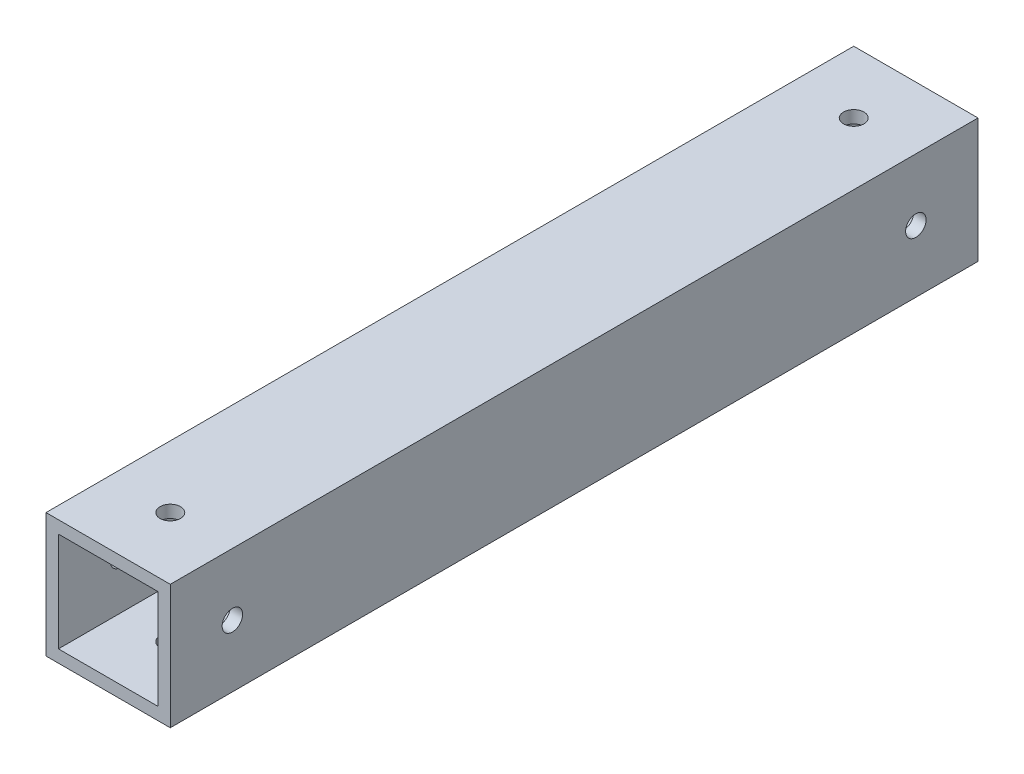
ISO-10303-21;
HEADER;
FILE_DESCRIPTION(('STEP AP214'),'2;1');
FILE_NAME('part.step','',(''),(''),'','','');
FILE_SCHEMA(('AUTOMOTIVE_DESIGN { 1 0 10303 214 1 1 1 1 }'));
ENDSEC;
DATA;
#1=APPLICATION_CONTEXT('core data for automotive mechanical design processes');
#2=APPLICATION_PROTOCOL_DEFINITION('international standard','automotive_design',2000,#1);
#3=PRODUCT_CONTEXT('',#1,'mechanical');
#4=PRODUCT('Part','Part','',(#3));
#5=PRODUCT_RELATED_PRODUCT_CATEGORY('part','',(#4));
#6=PRODUCT_DEFINITION_FORMATION('','',#4);
#7=PRODUCT_DEFINITION_CONTEXT('part definition',#1,'design');
#8=PRODUCT_DEFINITION('design','',#6,#7);
#9=PRODUCT_DEFINITION_SHAPE('','',#8);
#10=(LENGTH_UNIT() NAMED_UNIT(*) SI_UNIT(.MILLI.,.METRE.));
#11=(NAMED_UNIT(*) PLANE_ANGLE_UNIT() SI_UNIT($,.RADIAN.));
#12=(NAMED_UNIT(*) SI_UNIT($,.STERADIAN.) SOLID_ANGLE_UNIT());
#13=UNCERTAINTY_MEASURE_WITH_UNIT(LENGTH_MEASURE(1.E-05),#10,'distance_accuracy_value','');
#14=(GEOMETRIC_REPRESENTATION_CONTEXT(3) GLOBAL_UNCERTAINTY_ASSIGNED_CONTEXT((#13)) GLOBAL_UNIT_ASSIGNED_CONTEXT((#10,
#11,#12)) REPRESENTATION_CONTEXT('',''));
#15=CARTESIAN_POINT('',(0.,0.,0.));
#16=DIRECTION('',(0.,0.,1.));
#17=DIRECTION('',(1.,0.,0.));
#18=AXIS2_PLACEMENT_3D('',#15,#16,#17);
#19=CARTESIAN_POINT('',(0.,0.,130.));
#20=DIRECTION('',(0.,0.,-1.));
#21=DIRECTION('',(-1.,0.,0.));
#22=AXIS2_PLACEMENT_3D('',#19,#20,#21);
#23=PLANE('',#22);
#24=DIRECTION('',(0.,1.,0.));
#25=VECTOR('',#24,1.);
#26=CARTESIAN_POINT('',(10.,-10.,130.));
#27=LINE('',#26,#25);
#28=CARTESIAN_POINT('',(10.,-10.,130.));
#29=VERTEX_POINT('',#28);
#30=CARTESIAN_POINT('',(10.,10.,130.));
#31=VERTEX_POINT('',#30);
#32=EDGE_CURVE('E146',#29,#31,#27,.T.);
#33=ORIENTED_EDGE('',*,*,#32,.T.);
#34=DIRECTION('',(-1.,0.,0.));
#35=VECTOR('',#34,1.);
#36=CARTESIAN_POINT('',(-10.,10.,130.));
#37=LINE('',#36,#35);
#38=CARTESIAN_POINT('',(-10.,10.,130.));
#39=VERTEX_POINT('',#38);
#40=EDGE_CURVE('E149',#31,#39,#37,.T.);
#41=ORIENTED_EDGE('',*,*,#40,.T.);
#42=DIRECTION('',(0.,-1.,0.));
#43=VECTOR('',#42,1.);
#44=CARTESIAN_POINT('',(-10.,-10.,130.));
#45=LINE('',#44,#43);
#46=CARTESIAN_POINT('',(-10.,-10.,130.));
#47=VERTEX_POINT('',#46);
#48=EDGE_CURVE('E152',#39,#47,#45,.T.);
#49=ORIENTED_EDGE('',*,*,#48,.T.);
#50=DIRECTION('',(1.,0.,0.));
#51=VECTOR('',#50,1.);
#52=CARTESIAN_POINT('',(-10.,-10.,130.));
#53=LINE('',#52,#51);
#54=EDGE_CURVE('E154',#47,#29,#53,.T.);
#55=ORIENTED_EDGE('',*,*,#54,.T.);
#56=EDGE_LOOP('',(#33,#41,#49,#55));
#57=FACE_BOUND('',#56,.T.);
#58=DIRECTION('',(0.,1.,0.));
#59=VECTOR('',#58,1.);
#60=CARTESIAN_POINT('',(8.,-7.99999999999999,130.));
#61=LINE('',#60,#59);
#62=CARTESIAN_POINT('',(8.,-7.99999999999999,130.));
#63=VERTEX_POINT('',#62);
#64=CARTESIAN_POINT('',(8.,8.,130.));
#65=VERTEX_POINT('',#64);
#66=EDGE_CURVE('E108',#63,#65,#61,.T.);
#67=ORIENTED_EDGE('',*,*,#66,.F.);
#68=DIRECTION('',(1.,0.,0.));
#69=VECTOR('',#68,1.);
#70=CARTESIAN_POINT('',(-8.,-7.99999999999999,130.));
#71=LINE('',#70,#69);
#72=CARTESIAN_POINT('',(-8.,-7.99999999999999,130.));
#73=VERTEX_POINT('',#72);
#74=EDGE_CURVE('E130',#73,#63,#71,.T.);
#75=ORIENTED_EDGE('',*,*,#74,.F.);
#76=DIRECTION('',(0.,-1.,0.));
#77=VECTOR('',#76,1.);
#78=CARTESIAN_POINT('',(-8.,-7.99999999999999,130.));
#79=LINE('',#78,#77);
#80=CARTESIAN_POINT('',(-8.,8.,130.));
#81=VERTEX_POINT('',#80);
#82=EDGE_CURVE('E128',#81,#73,#79,.T.);
#83=ORIENTED_EDGE('',*,*,#82,.F.);
#84=DIRECTION('',(-1.,0.,0.));
#85=VECTOR('',#84,1.);
#86=CARTESIAN_POINT('',(-8.,8.,130.));
#87=LINE('',#86,#85);
#88=EDGE_CURVE('E116',#65,#81,#87,.T.);
#89=ORIENTED_EDGE('',*,*,#88,.F.);
#90=EDGE_LOOP('',(#67,#75,#83,#89));
#91=FACE_BOUND('',#90,.T.);
#92=ADVANCED_FACE('F41',(#57,#91),#23,.F.);
#93=CARTESIAN_POINT('',(0.,0.,0.));
#94=DIRECTION('',(0.,0.,-1.));
#95=DIRECTION('',(-1.,0.,0.));
#96=AXIS2_PLACEMENT_3D('',#93,#94,#95);
#97=PLANE('',#96);
#98=DIRECTION('',(0.,1.,0.));
#99=VECTOR('',#98,1.);
#100=CARTESIAN_POINT('',(10.,-10.,0.));
#101=LINE('',#100,#99);
#102=CARTESIAN_POINT('',(10.,-10.,0.));
#103=VERTEX_POINT('',#102);
#104=CARTESIAN_POINT('',(10.,10.,0.));
#105=VERTEX_POINT('',#104);
#106=EDGE_CURVE('E124',#103,#105,#101,.T.);
#107=ORIENTED_EDGE('',*,*,#106,.F.);
#108=DIRECTION('',(1.,0.,0.));
#109=VECTOR('',#108,1.);
#110=CARTESIAN_POINT('',(-10.,-10.,0.));
#111=LINE('',#110,#109);
#112=CARTESIAN_POINT('',(-10.,-10.,0.));
#113=VERTEX_POINT('',#112);
#114=EDGE_CURVE('E150',#113,#103,#111,.T.);
#115=ORIENTED_EDGE('',*,*,#114,.F.);
#116=DIRECTION('',(0.,-1.,0.));
#117=VECTOR('',#116,1.);
#118=CARTESIAN_POINT('',(-10.,-10.,0.));
#119=LINE('',#118,#117);
#120=CARTESIAN_POINT('',(-10.,10.,0.));
#121=VERTEX_POINT('',#120);
#122=EDGE_CURVE('E161',#121,#113,#119,.T.);
#123=ORIENTED_EDGE('',*,*,#122,.F.);
#124=DIRECTION('',(-1.,0.,0.));
#125=VECTOR('',#124,1.);
#126=CARTESIAN_POINT('',(-10.,10.,0.));
#127=LINE('',#126,#125);
#128=EDGE_CURVE('E159',#105,#121,#127,.T.);
#129=ORIENTED_EDGE('',*,*,#128,.F.);
#130=EDGE_LOOP('',(#107,#115,#123,#129));
#131=FACE_BOUND('',#130,.T.);
#132=DIRECTION('',(1.,0.,0.));
#133=VECTOR('',#132,1.);
#134=CARTESIAN_POINT('',(-8.,-7.99999999999999,0.));
#135=LINE('',#134,#133);
#136=CARTESIAN_POINT('',(-8.,-7.99999999999999,0.));
#137=VERTEX_POINT('',#136);
#138=CARTESIAN_POINT('',(8.,-7.99999999999999,0.));
#139=VERTEX_POINT('',#138);
#140=EDGE_CURVE('E117',#137,#139,#135,.T.);
#141=ORIENTED_EDGE('',*,*,#140,.T.);
#142=DIRECTION('',(0.,1.,0.));
#143=VECTOR('',#142,1.);
#144=CARTESIAN_POINT('',(8.,-7.99999999999999,0.));
#145=LINE('',#144,#143);
#146=CARTESIAN_POINT('',(8.,8.,0.));
#147=VERTEX_POINT('',#146);
#148=EDGE_CURVE('E66',#139,#147,#145,.T.);
#149=ORIENTED_EDGE('',*,*,#148,.T.);
#150=DIRECTION('',(-1.,0.,0.));
#151=VECTOR('',#150,1.);
#152=CARTESIAN_POINT('',(-8.,8.,0.));
#153=LINE('',#152,#151);
#154=CARTESIAN_POINT('',(-8.,8.,0.));
#155=VERTEX_POINT('',#154);
#156=EDGE_CURVE('E123',#147,#155,#153,.T.);
#157=ORIENTED_EDGE('',*,*,#156,.T.);
#158=DIRECTION('',(0.,-1.,0.));
#159=VECTOR('',#158,1.);
#160=CARTESIAN_POINT('',(-8.,-7.99999999999999,0.));
#161=LINE('',#160,#159);
#162=EDGE_CURVE('E138',#155,#137,#161,.T.);
#163=ORIENTED_EDGE('',*,*,#162,.T.);
#164=EDGE_LOOP('',(#141,#149,#157,#163));
#165=FACE_BOUND('',#164,.T.);
#166=ADVANCED_FACE('F241',(#131,#165),#97,.T.);
#167=CARTESIAN_POINT('',(10.,-10.,130.));
#168=DIRECTION('',(-1.,0.,0.));
#169=DIRECTION('',(0.,0.,1.));
#170=AXIS2_PLACEMENT_3D('',#167,#168,#169);
#171=PLANE('',#170);
#172=CARTESIAN_POINT('',(10.,0.,120.));
#173=DIRECTION('',(1.,0.,0.));
#174=DIRECTION('',(0.,0.,-1.));
#175=AXIS2_PLACEMENT_3D('',#172,#173,#174);
#176=CIRCLE('',#175,1.65);
#177=CARTESIAN_POINT('',(10.,0.,118.35));
#178=VERTEX_POINT('',#177);
#179=EDGE_CURVE('E189',#178,#178,#176,.T.);
#180=ORIENTED_EDGE('',*,*,#179,.F.);
#181=EDGE_LOOP('',(#180));
#182=FACE_BOUND('',#181,.T.);
#183=CARTESIAN_POINT('',(10.,0.,9.99999999999999));
#184=DIRECTION('',(1.,0.,0.));
#185=DIRECTION('',(0.,0.,-1.));
#186=AXIS2_PLACEMENT_3D('',#183,#184,#185);
#187=CIRCLE('',#186,1.65);
#188=CARTESIAN_POINT('',(10.,0.,8.34999999999999));
#189=VERTEX_POINT('',#188);
#190=EDGE_CURVE('E194',#189,#189,#187,.T.);
#191=ORIENTED_EDGE('',*,*,#190,.F.);
#192=EDGE_LOOP('',(#191));
#193=FACE_BOUND('',#192,.T.);
#194=ORIENTED_EDGE('',*,*,#106,.T.);
#195=DIRECTION('',(0.,0.,-1.));
#196=VECTOR('',#195,1.);
#197=CARTESIAN_POINT('',(10.,10.,130.));
#198=LINE('',#197,#196);
#199=EDGE_CURVE('E11',#31,#105,#198,.T.);
#200=ORIENTED_EDGE('',*,*,#199,.F.);
#201=ORIENTED_EDGE('',*,*,#32,.F.);
#202=DIRECTION('',(0.,0.,-1.));
#203=VECTOR('',#202,1.);
#204=CARTESIAN_POINT('',(10.,-10.,130.));
#205=LINE('',#204,#203);
#206=EDGE_CURVE('E156',#29,#103,#205,.T.);
#207=ORIENTED_EDGE('',*,*,#206,.T.);
#208=EDGE_LOOP('',(#194,#200,#201,#207));
#209=FACE_BOUND('',#208,.T.);
#210=ADVANCED_FACE('F43',(#182,#193,#209),#171,.F.);
#211=CARTESIAN_POINT('',(-10.,10.,130.));
#212=DIRECTION('',(0.,-1.,0.));
#213=DIRECTION('',(0.,0.,-1.));
#214=AXIS2_PLACEMENT_3D('',#211,#212,#213);
#215=PLANE('',#214);
#216=CARTESIAN_POINT('',(0.,10.,120.));
#217=DIRECTION('',(0.,1.,0.));
#218=DIRECTION('',(0.,0.,1.));
#219=AXIS2_PLACEMENT_3D('',#216,#217,#218);
#220=CIRCLE('',#219,1.65);
#221=CARTESIAN_POINT('',(0.,10.,121.65));
#222=VERTEX_POINT('',#221);
#223=EDGE_CURVE('E175',#222,#222,#220,.T.);
#224=ORIENTED_EDGE('',*,*,#223,.F.);
#225=EDGE_LOOP('',(#224));
#226=FACE_BOUND('',#225,.T.);
#227=CARTESIAN_POINT('',(0.,10.,9.99999999999999));
#228=DIRECTION('',(0.,1.,0.));
#229=DIRECTION('',(0.,0.,-1.));
#230=AXIS2_PLACEMENT_3D('',#227,#228,#229);
#231=CIRCLE('',#230,1.65);
#232=CARTESIAN_POINT('',(0.,10.,8.34999999999999));
#233=VERTEX_POINT('',#232);
#234=EDGE_CURVE('E205',#233,#233,#231,.T.);
#235=ORIENTED_EDGE('',*,*,#234,.F.);
#236=EDGE_LOOP('',(#235));
#237=FACE_BOUND('',#236,.T.);
#238=ORIENTED_EDGE('',*,*,#128,.T.);
#239=DIRECTION('',(0.,0.,-1.));
#240=VECTOR('',#239,1.);
#241=CARTESIAN_POINT('',(-10.,10.,130.));
#242=LINE('',#241,#240);
#243=EDGE_CURVE('E50',#39,#121,#242,.T.);
#244=ORIENTED_EDGE('',*,*,#243,.F.);
#245=ORIENTED_EDGE('',*,*,#40,.F.);
#246=ORIENTED_EDGE('',*,*,#199,.T.);
#247=EDGE_LOOP('',(#238,#244,#245,#246));
#248=FACE_BOUND('',#247,.T.);
#249=ADVANCED_FACE('F256',(#226,#237,#248),#215,.F.);
#250=CARTESIAN_POINT('',(-10.,-10.,130.));
#251=DIRECTION('',(1.,0.,0.));
#252=DIRECTION('',(0.,0.,-1.));
#253=AXIS2_PLACEMENT_3D('',#250,#251,#252);
#254=PLANE('',#253);
#255=CARTESIAN_POINT('',(-10.,0.,120.));
#256=DIRECTION('',(1.,0.,0.));
#257=DIRECTION('',(0.,0.,-1.));
#258=AXIS2_PLACEMENT_3D('',#255,#256,#257);
#259=CIRCLE('',#258,1.65);
#260=CARTESIAN_POINT('',(-10.,0.,118.35));
#261=VERTEX_POINT('',#260);
#262=EDGE_CURVE('E183',#261,#261,#259,.T.);
#263=ORIENTED_EDGE('',*,*,#262,.T.);
#264=EDGE_LOOP('',(#263));
#265=FACE_BOUND('',#264,.T.);
#266=CARTESIAN_POINT('',(-10.,0.,9.99999999999999));
#267=DIRECTION('',(1.,0.,0.));
#268=DIRECTION('',(0.,0.,-1.));
#269=AXIS2_PLACEMENT_3D('',#266,#267,#268);
#270=CIRCLE('',#269,1.65);
#271=CARTESIAN_POINT('',(-10.,0.,8.34999999999999));
#272=VERTEX_POINT('',#271);
#273=EDGE_CURVE('E199',#272,#272,#270,.T.);
#274=ORIENTED_EDGE('',*,*,#273,.T.);
#275=EDGE_LOOP('',(#274));
#276=FACE_BOUND('',#275,.T.);
#277=ORIENTED_EDGE('',*,*,#122,.T.);
#278=DIRECTION('',(0.,0.,-1.));
#279=VECTOR('',#278,1.);
#280=CARTESIAN_POINT('',(-10.,-10.,130.));
#281=LINE('',#280,#279);
#282=EDGE_CURVE('E166',#47,#113,#281,.T.);
#283=ORIENTED_EDGE('',*,*,#282,.F.);
#284=ORIENTED_EDGE('',*,*,#48,.F.);
#285=ORIENTED_EDGE('',*,*,#243,.T.);
#286=EDGE_LOOP('',(#277,#283,#284,#285));
#287=FACE_BOUND('',#286,.T.);
#288=ADVANCED_FACE('F254',(#265,#276,#287),#254,.F.);
#289=CARTESIAN_POINT('',(-10.,-10.,130.));
#290=DIRECTION('',(0.,1.,0.));
#291=DIRECTION('',(0.,0.,1.));
#292=AXIS2_PLACEMENT_3D('',#289,#290,#291);
#293=PLANE('',#292);
#294=CARTESIAN_POINT('',(0.,-10.,120.));
#295=DIRECTION('',(0.,1.,0.));
#296=DIRECTION('',(0.,0.,1.));
#297=AXIS2_PLACEMENT_3D('',#294,#295,#296);
#298=CIRCLE('',#297,1.65);
#299=CARTESIAN_POINT('',(0.,-10.,121.65));
#300=VERTEX_POINT('',#299);
#301=EDGE_CURVE('E136',#300,#300,#298,.T.);
#302=ORIENTED_EDGE('',*,*,#301,.T.);
#303=EDGE_LOOP('',(#302));
#304=FACE_BOUND('',#303,.T.);
#305=CARTESIAN_POINT('',(0.,-10.,9.99999999999999));
#306=DIRECTION('',(0.,1.,0.));
#307=DIRECTION('',(0.,0.,1.));
#308=AXIS2_PLACEMENT_3D('',#305,#306,#307);
#309=CIRCLE('',#308,1.65);
#310=CARTESIAN_POINT('',(0.,-10.,11.65));
#311=VERTEX_POINT('',#310);
#312=EDGE_CURVE('E179',#311,#311,#309,.T.);
#313=ORIENTED_EDGE('',*,*,#312,.T.);
#314=EDGE_LOOP('',(#313));
#315=FACE_BOUND('',#314,.T.);
#316=ORIENTED_EDGE('',*,*,#114,.T.);
#317=ORIENTED_EDGE('',*,*,#206,.F.);
#318=ORIENTED_EDGE('',*,*,#54,.F.);
#319=ORIENTED_EDGE('',*,*,#282,.T.);
#320=EDGE_LOOP('',(#316,#317,#318,#319));
#321=FACE_BOUND('',#320,.T.);
#322=ADVANCED_FACE('F218',(#304,#315,#321),#293,.F.);
#323=CARTESIAN_POINT('',(8.,-7.99999999999999,130.));
#324=DIRECTION('',(-1.,0.,0.));
#325=DIRECTION('',(0.,0.,1.));
#326=AXIS2_PLACEMENT_3D('',#323,#324,#325);
#327=PLANE('',#326);
#328=CARTESIAN_POINT('',(8.,0.,120.));
#329=DIRECTION('',(-1.,0.,0.));
#330=DIRECTION('',(0.,0.,1.));
#331=AXIS2_PLACEMENT_3D('',#328,#329,#330);
#332=CIRCLE('',#331,1.65);
#333=CARTESIAN_POINT('',(8.,0.,121.65));
#334=VERTEX_POINT('',#333);
#335=EDGE_CURVE('E202',#334,#334,#332,.T.);
#336=ORIENTED_EDGE('',*,*,#335,.F.);
#337=EDGE_LOOP('',(#336));
#338=FACE_BOUND('',#337,.T.);
#339=CARTESIAN_POINT('',(8.,0.,9.99999999999999));
#340=DIRECTION('',(-1.,0.,0.));
#341=DIRECTION('',(0.,0.,1.));
#342=AXIS2_PLACEMENT_3D('',#339,#340,#341);
#343=CIRCLE('',#342,1.65);
#344=CARTESIAN_POINT('',(8.,0.,11.65));
#345=VERTEX_POINT('',#344);
#346=EDGE_CURVE('E182',#345,#345,#343,.T.);
#347=ORIENTED_EDGE('',*,*,#346,.F.);
#348=EDGE_LOOP('',(#347));
#349=FACE_BOUND('',#348,.T.);
#350=ORIENTED_EDGE('',*,*,#148,.F.);
#351=DIRECTION('',(0.,0.,-1.));
#352=VECTOR('',#351,1.);
#353=CARTESIAN_POINT('',(8.,-7.99999999999999,130.));
#354=LINE('',#353,#352);
#355=EDGE_CURVE('E112',#63,#139,#354,.T.);
#356=ORIENTED_EDGE('',*,*,#355,.F.);
#357=ORIENTED_EDGE('',*,*,#66,.T.);
#358=DIRECTION('',(0.,0.,-1.));
#359=VECTOR('',#358,1.);
#360=CARTESIAN_POINT('',(8.,8.,130.));
#361=LINE('',#360,#359);
#362=EDGE_CURVE('E111',#65,#147,#361,.T.);
#363=ORIENTED_EDGE('',*,*,#362,.T.);
#364=EDGE_LOOP('',(#350,#356,#357,#363));
#365=FACE_BOUND('',#364,.T.);
#366=ADVANCED_FACE('F110',(#338,#349,#365),#327,.T.);
#367=CARTESIAN_POINT('',(-8.,8.,130.));
#368=DIRECTION('',(0.,-1.,0.));
#369=DIRECTION('',(0.,0.,-1.));
#370=AXIS2_PLACEMENT_3D('',#367,#368,#369);
#371=PLANE('',#370);
#372=CARTESIAN_POINT('',(0.,8.,120.));
#373=DIRECTION('',(0.,-1.,0.));
#374=DIRECTION('',(0.,0.,-1.));
#375=AXIS2_PLACEMENT_3D('',#372,#373,#374);
#376=CIRCLE('',#375,1.65);
#377=CARTESIAN_POINT('',(0.,8.,118.35));
#378=VERTEX_POINT('',#377);
#379=EDGE_CURVE('E178',#378,#378,#376,.T.);
#380=ORIENTED_EDGE('',*,*,#379,.F.);
#381=EDGE_LOOP('',(#380));
#382=FACE_BOUND('',#381,.T.);
#383=CARTESIAN_POINT('',(0.,8.,9.99999999999999));
#384=DIRECTION('',(0.,-1.,0.));
#385=DIRECTION('',(0.,0.,-1.));
#386=AXIS2_PLACEMENT_3D('',#383,#384,#385);
#387=CIRCLE('',#386,1.65);
#388=CARTESIAN_POINT('',(0.,8.,8.34999999999999));
#389=VERTEX_POINT('',#388);
#390=EDGE_CURVE('E174',#389,#389,#387,.T.);
#391=ORIENTED_EDGE('',*,*,#390,.F.);
#392=EDGE_LOOP('',(#391));
#393=FACE_BOUND('',#392,.T.);
#394=ORIENTED_EDGE('',*,*,#156,.F.);
#395=ORIENTED_EDGE('',*,*,#362,.F.);
#396=ORIENTED_EDGE('',*,*,#88,.T.);
#397=DIRECTION('',(0.,0.,-1.));
#398=VECTOR('',#397,1.);
#399=CARTESIAN_POINT('',(-8.,8.,130.));
#400=LINE('',#399,#398);
#401=EDGE_CURVE('E125',#81,#155,#400,.T.);
#402=ORIENTED_EDGE('',*,*,#401,.T.);
#403=EDGE_LOOP('',(#394,#395,#396,#402));
#404=FACE_BOUND('',#403,.T.);
#405=ADVANCED_FACE('F120',(#382,#393,#404),#371,.T.);
#406=CARTESIAN_POINT('',(-8.,-7.99999999999999,130.));
#407=DIRECTION('',(1.,0.,0.));
#408=DIRECTION('',(0.,0.,-1.));
#409=AXIS2_PLACEMENT_3D('',#406,#407,#408);
#410=PLANE('',#409);
#411=CARTESIAN_POINT('',(-8.,0.,120.));
#412=DIRECTION('',(1.,0.,0.));
#413=DIRECTION('',(0.,0.,-1.));
#414=AXIS2_PLACEMENT_3D('',#411,#412,#413);
#415=CIRCLE('',#414,1.65);
#416=CARTESIAN_POINT('',(-8.,0.,118.35));
#417=VERTEX_POINT('',#416);
#418=EDGE_CURVE('E45',#417,#417,#415,.T.);
#419=ORIENTED_EDGE('',*,*,#418,.F.);
#420=EDGE_LOOP('',(#419));
#421=FACE_BOUND('',#420,.T.);
#422=CARTESIAN_POINT('',(-8.,0.,9.99999999999999));
#423=DIRECTION('',(1.,0.,0.));
#424=DIRECTION('',(0.,0.,-1.));
#425=AXIS2_PLACEMENT_3D('',#422,#423,#424);
#426=CIRCLE('',#425,1.65);
#427=CARTESIAN_POINT('',(-8.,0.,8.34999999999999));
#428=VERTEX_POINT('',#427);
#429=EDGE_CURVE('E180',#428,#428,#426,.T.);
#430=ORIENTED_EDGE('',*,*,#429,.F.);
#431=EDGE_LOOP('',(#430));
#432=FACE_BOUND('',#431,.T.);
#433=ORIENTED_EDGE('',*,*,#162,.F.);
#434=ORIENTED_EDGE('',*,*,#401,.F.);
#435=ORIENTED_EDGE('',*,*,#82,.T.);
#436=DIRECTION('',(0.,0.,-1.));
#437=VECTOR('',#436,1.);
#438=CARTESIAN_POINT('',(-8.,-7.99999999999999,130.));
#439=LINE('',#438,#437);
#440=EDGE_CURVE('E58',#73,#137,#439,.T.);
#441=ORIENTED_EDGE('',*,*,#440,.T.);
#442=EDGE_LOOP('',(#433,#434,#435,#441));
#443=FACE_BOUND('',#442,.T.);
#444=ADVANCED_FACE('F283',(#421,#432,#443),#410,.T.);
#445=CARTESIAN_POINT('',(-8.,-7.99999999999999,130.));
#446=DIRECTION('',(0.,1.,0.));
#447=DIRECTION('',(0.,0.,1.));
#448=AXIS2_PLACEMENT_3D('',#445,#446,#447);
#449=PLANE('',#448);
#450=CARTESIAN_POINT('',(0.,-7.99999999999999,120.));
#451=DIRECTION('',(0.,1.,0.));
#452=DIRECTION('',(0.,0.,1.));
#453=AXIS2_PLACEMENT_3D('',#450,#451,#452);
#454=CIRCLE('',#453,1.65);
#455=CARTESIAN_POINT('',(0.,-7.99999999999999,121.65));
#456=VERTEX_POINT('',#455);
#457=EDGE_CURVE('E176',#456,#456,#454,.T.);
#458=ORIENTED_EDGE('',*,*,#457,.F.);
#459=EDGE_LOOP('',(#458));
#460=FACE_BOUND('',#459,.T.);
#461=CARTESIAN_POINT('',(0.,-7.99999999999999,9.99999999999999));
#462=DIRECTION('',(0.,1.,0.));
#463=DIRECTION('',(0.,0.,1.));
#464=AXIS2_PLACEMENT_3D('',#461,#462,#463);
#465=CIRCLE('',#464,1.65);
#466=CARTESIAN_POINT('',(0.,-7.99999999999999,11.65));
#467=VERTEX_POINT('',#466);
#468=EDGE_CURVE('E171',#467,#467,#465,.T.);
#469=ORIENTED_EDGE('',*,*,#468,.F.);
#470=EDGE_LOOP('',(#469));
#471=FACE_BOUND('',#470,.T.);
#472=ORIENTED_EDGE('',*,*,#140,.F.);
#473=ORIENTED_EDGE('',*,*,#440,.F.);
#474=ORIENTED_EDGE('',*,*,#74,.T.);
#475=ORIENTED_EDGE('',*,*,#355,.T.);
#476=EDGE_LOOP('',(#472,#473,#474,#475));
#477=FACE_BOUND('',#476,.T.);
#478=ADVANCED_FACE('F234',(#460,#471,#477),#449,.T.);
#479=CARTESIAN_POINT('',(0.,-20.,9.99999999999999));
#480=DIRECTION('',(0.,1.,0.));
#481=DIRECTION('',(0.,0.,1.));
#482=AXIS2_PLACEMENT_3D('',#479,#480,#481);
#483=CYLINDRICAL_SURFACE('',#482,1.65);
#484=ORIENTED_EDGE('',*,*,#468,.T.);
#485=EDGE_LOOP('',(#484));
#486=FACE_BOUND('',#485,.T.);
#487=ORIENTED_EDGE('',*,*,#312,.F.);
#488=EDGE_LOOP('',(#487));
#489=FACE_BOUND('',#488,.T.);
#490=ADVANCED_FACE('F224',(#486,#489),#483,.F.);
#491=CARTESIAN_POINT('',(0.,-20.,120.));
#492=DIRECTION('',(0.,1.,0.));
#493=DIRECTION('',(0.,0.,1.));
#494=AXIS2_PLACEMENT_3D('',#491,#492,#493);
#495=CYLINDRICAL_SURFACE('',#494,1.65);
#496=ORIENTED_EDGE('',*,*,#457,.T.);
#497=EDGE_LOOP('',(#496));
#498=FACE_BOUND('',#497,.T.);
#499=ORIENTED_EDGE('',*,*,#301,.F.);
#500=EDGE_LOOP('',(#499));
#501=FACE_BOUND('',#500,.T.);
#502=ADVANCED_FACE('F221',(#498,#501),#495,.F.);
#503=ORIENTED_EDGE('',*,*,#390,.T.);
#504=EDGE_LOOP('',(#503));
#505=FACE_BOUND('',#504,.T.);
#506=ORIENTED_EDGE('',*,*,#234,.T.);
#507=EDGE_LOOP('',(#506));
#508=FACE_BOUND('',#507,.T.);
#509=ADVANCED_FACE('F223',(#505,#508),#483,.F.);
#510=ORIENTED_EDGE('',*,*,#379,.T.);
#511=EDGE_LOOP('',(#510));
#512=FACE_BOUND('',#511,.T.);
#513=ORIENTED_EDGE('',*,*,#223,.T.);
#514=EDGE_LOOP('',(#513));
#515=FACE_BOUND('',#514,.T.);
#516=ADVANCED_FACE('F227',(#512,#515),#495,.F.);
#517=CARTESIAN_POINT('',(-10.,0.,9.99999999999999));
#518=DIRECTION('',(1.,0.,0.));
#519=DIRECTION('',(0.,0.,-1.));
#520=AXIS2_PLACEMENT_3D('',#517,#518,#519);
#521=CYLINDRICAL_SURFACE('',#520,1.65);
#522=ORIENTED_EDGE('',*,*,#429,.T.);
#523=EDGE_LOOP('',(#522));
#524=FACE_BOUND('',#523,.T.);
#525=ORIENTED_EDGE('',*,*,#273,.F.);
#526=EDGE_LOOP('',(#525));
#527=FACE_BOUND('',#526,.T.);
#528=ADVANCED_FACE('F238',(#524,#527),#521,.F.);
#529=CARTESIAN_POINT('',(-10.,0.,120.));
#530=DIRECTION('',(1.,0.,0.));
#531=DIRECTION('',(0.,0.,-1.));
#532=AXIS2_PLACEMENT_3D('',#529,#530,#531);
#533=CYLINDRICAL_SURFACE('',#532,1.65);
#534=ORIENTED_EDGE('',*,*,#418,.T.);
#535=EDGE_LOOP('',(#534));
#536=FACE_BOUND('',#535,.T.);
#537=ORIENTED_EDGE('',*,*,#262,.F.);
#538=EDGE_LOOP('',(#537));
#539=FACE_BOUND('',#538,.T.);
#540=ADVANCED_FACE('F314',(#536,#539),#533,.F.);
#541=ORIENTED_EDGE('',*,*,#346,.T.);
#542=EDGE_LOOP('',(#541));
#543=FACE_BOUND('',#542,.T.);
#544=ORIENTED_EDGE('',*,*,#190,.T.);
#545=EDGE_LOOP('',(#544));
#546=FACE_BOUND('',#545,.T.);
#547=ADVANCED_FACE('F310',(#543,#546),#521,.F.);
#548=ORIENTED_EDGE('',*,*,#335,.T.);
#549=EDGE_LOOP('',(#548));
#550=FACE_BOUND('',#549,.T.);
#551=ORIENTED_EDGE('',*,*,#179,.T.);
#552=EDGE_LOOP('',(#551));
#553=FACE_BOUND('',#552,.T.);
#554=ADVANCED_FACE('F313',(#550,#553),#533,.F.);
#555=CLOSED_SHELL('',(#92,#166,#210,#249,#288,#322,#366,#405,#444,#478,#490,#502,#509,#516,#528,
#540,#547,#554));
#556=MANIFOLD_SOLID_BREP('B2',#555);
#557=ADVANCED_BREP_SHAPE_REPRESENTATION('',(#18,#556),#14);
#558=SHAPE_DEFINITION_REPRESENTATION(#9,#557);
ENDSEC;
END-ISO-10303-21;
